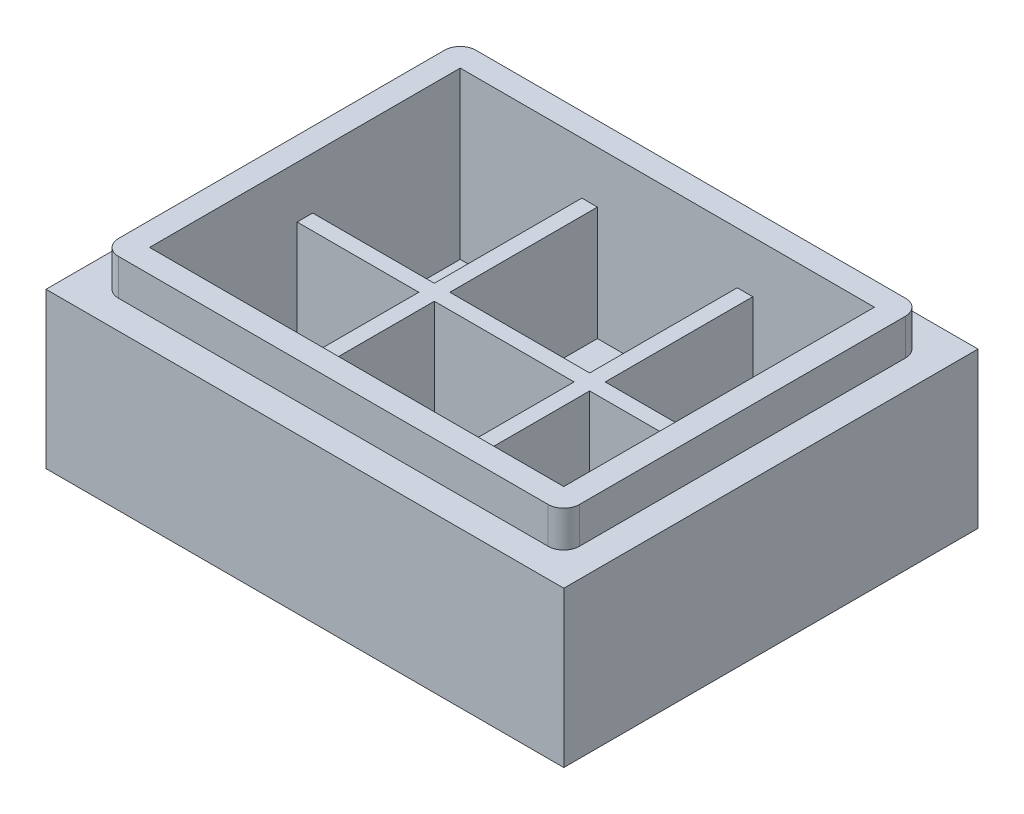
ISO-10303-21;
HEADER;
FILE_DESCRIPTION(('STEP AP214'),'2;1');
FILE_NAME('part.step','',(''),(''),'','','');
FILE_SCHEMA(('AUTOMOTIVE_DESIGN { 1 0 10303 214 1 1 1 1 }'));
ENDSEC;
DATA;
#1=APPLICATION_CONTEXT('core data for automotive mechanical design processes');
#2=APPLICATION_PROTOCOL_DEFINITION('international standard','automotive_design',2000,#1);
#3=PRODUCT_CONTEXT('',#1,'mechanical');
#4=PRODUCT('Part','Part','',(#3));
#5=PRODUCT_RELATED_PRODUCT_CATEGORY('part','',(#4));
#6=PRODUCT_DEFINITION_FORMATION('','',#4);
#7=PRODUCT_DEFINITION_CONTEXT('part definition',#1,'design');
#8=PRODUCT_DEFINITION('design','',#6,#7);
#9=PRODUCT_DEFINITION_SHAPE('','',#8);
#10=(LENGTH_UNIT() NAMED_UNIT(*) SI_UNIT(.MILLI.,.METRE.));
#11=(NAMED_UNIT(*) PLANE_ANGLE_UNIT() SI_UNIT($,.RADIAN.));
#12=(NAMED_UNIT(*) SI_UNIT($,.STERADIAN.) SOLID_ANGLE_UNIT());
#13=UNCERTAINTY_MEASURE_WITH_UNIT(LENGTH_MEASURE(1.E-05),#10,'distance_accuracy_value','');
#14=(GEOMETRIC_REPRESENTATION_CONTEXT(3) GLOBAL_UNCERTAINTY_ASSIGNED_CONTEXT((#13)) GLOBAL_UNIT_ASSIGNED_CONTEXT((#10,
#11,#12)) REPRESENTATION_CONTEXT('',''));
#15=CARTESIAN_POINT('',(0.,0.,0.));
#16=DIRECTION('',(0.,0.,1.));
#17=DIRECTION('',(1.,0.,0.));
#18=AXIS2_PLACEMENT_3D('',#15,#16,#17);
#19=CARTESIAN_POINT('',(0.,30.,0.));
#20=DIRECTION('',(0.,1.,0.));
#21=DIRECTION('',(0.,0.,1.));
#22=AXIS2_PLACEMENT_3D('',#19,#20,#21);
#23=PLANE('',#22);
#24=DIRECTION('',(0.,0.,-1.));
#25=VECTOR('',#24,1.);
#26=CARTESIAN_POINT('',(50.,30.,-40.));
#27=LINE('',#26,#25);
#28=CARTESIAN_POINT('',(50.,30.,40.));
#29=VERTEX_POINT('',#28);
#30=CARTESIAN_POINT('',(50.,30.,-40.));
#31=VERTEX_POINT('',#30);
#32=EDGE_CURVE('E497',#29,#31,#27,.T.);
#33=ORIENTED_EDGE('',*,*,#32,.T.);
#34=DIRECTION('',(-1.,0.,0.));
#35=VECTOR('',#34,1.);
#36=CARTESIAN_POINT('',(-50.,30.,-40.));
#37=LINE('',#36,#35);
#38=CARTESIAN_POINT('',(-50.,30.,-40.));
#39=VERTEX_POINT('',#38);
#40=EDGE_CURVE('E500',#31,#39,#37,.T.);
#41=ORIENTED_EDGE('',*,*,#40,.T.);
#42=DIRECTION('',(0.,0.,1.));
#43=VECTOR('',#42,1.);
#44=CARTESIAN_POINT('',(-50.,30.,-40.));
#45=LINE('',#44,#43);
#46=CARTESIAN_POINT('',(-50.,30.,40.));
#47=VERTEX_POINT('',#46);
#48=EDGE_CURVE('E503',#39,#47,#45,.T.);
#49=ORIENTED_EDGE('',*,*,#48,.T.);
#50=DIRECTION('',(1.,0.,0.));
#51=VECTOR('',#50,1.);
#52=CARTESIAN_POINT('',(-50.,30.,40.));
#53=LINE('',#52,#51);
#54=EDGE_CURVE('E505',#47,#29,#53,.T.);
#55=ORIENTED_EDGE('',*,*,#54,.T.);
#56=EDGE_LOOP('',(#33,#41,#49,#55));
#57=FACE_BOUND('',#56,.T.);
#58=DIRECTION('',(1.,0.,0.));
#59=VECTOR('',#58,1.);
#60=CARTESIAN_POINT('',(-44.5,30.,34.5));
#61=LINE('',#60,#59);
#62=CARTESIAN_POINT('',(-41.5,30.,34.5));
#63=VERTEX_POINT('',#62);
#64=CARTESIAN_POINT('',(41.5,30.,34.5));
#65=VERTEX_POINT('',#64);
#66=EDGE_CURVE('E322',#63,#65,#61,.T.);
#67=ORIENTED_EDGE('',*,*,#66,.F.);
#68=CARTESIAN_POINT('',(-41.5,30.,31.5));
#69=DIRECTION('',(0.,1.,0.));
#70=DIRECTION('',(0.,0.,1.));
#71=AXIS2_PLACEMENT_3D('',#68,#69,#70);
#72=CIRCLE('',#71,3.);
#73=CARTESIAN_POINT('',(-44.5,30.,31.5));
#74=VERTEX_POINT('',#73);
#75=EDGE_CURVE('E50',#63,#74,#72,.F.);
#76=ORIENTED_EDGE('',*,*,#75,.T.);
#77=DIRECTION('',(0.,0.,1.));
#78=VECTOR('',#77,1.);
#79=CARTESIAN_POINT('',(-44.5,30.,-34.5));
#80=LINE('',#79,#78);
#81=CARTESIAN_POINT('',(-44.5,30.,-31.5));
#82=VERTEX_POINT('',#81);
#83=EDGE_CURVE('E305',#82,#74,#80,.T.);
#84=ORIENTED_EDGE('',*,*,#83,.F.);
#85=CARTESIAN_POINT('',(-41.5,30.,-31.5));
#86=DIRECTION('',(0.,1.,0.));
#87=DIRECTION('',(0.,0.,1.));
#88=AXIS2_PLACEMENT_3D('',#85,#86,#87);
#89=CIRCLE('',#88,3.);
#90=CARTESIAN_POINT('',(-41.5,30.,-34.5));
#91=VERTEX_POINT('',#90);
#92=EDGE_CURVE('E558',#82,#91,#89,.F.);
#93=ORIENTED_EDGE('',*,*,#92,.T.);
#94=DIRECTION('',(-1.,0.,0.));
#95=VECTOR('',#94,1.);
#96=CARTESIAN_POINT('',(44.5,30.,-34.5));
#97=LINE('',#96,#95);
#98=CARTESIAN_POINT('',(41.5,30.,-34.5));
#99=VERTEX_POINT('',#98);
#100=EDGE_CURVE('E310',#99,#91,#97,.T.);
#101=ORIENTED_EDGE('',*,*,#100,.F.);
#102=CARTESIAN_POINT('',(41.5,30.,-31.5));
#103=DIRECTION('',(0.,1.,0.));
#104=DIRECTION('',(0.,0.,1.));
#105=AXIS2_PLACEMENT_3D('',#102,#103,#104);
#106=CIRCLE('',#105,3.);
#107=CARTESIAN_POINT('',(44.5,30.,-31.5));
#108=VERTEX_POINT('',#107);
#109=EDGE_CURVE('E556',#99,#108,#106,.F.);
#110=ORIENTED_EDGE('',*,*,#109,.T.);
#111=DIRECTION('',(0.,0.,-1.));
#112=VECTOR('',#111,1.);
#113=CARTESIAN_POINT('',(44.5,30.,34.5));
#114=LINE('',#113,#112);
#115=CARTESIAN_POINT('',(44.5,30.,31.5));
#116=VERTEX_POINT('',#115);
#117=EDGE_CURVE('E324',#116,#108,#114,.T.);
#118=ORIENTED_EDGE('',*,*,#117,.F.);
#119=CARTESIAN_POINT('',(41.5,30.,31.5));
#120=DIRECTION('',(0.,1.,0.));
#121=DIRECTION('',(0.,0.,1.));
#122=AXIS2_PLACEMENT_3D('',#119,#120,#121);
#123=CIRCLE('',#122,3.);
#124=EDGE_CURVE('E11',#116,#65,#123,.F.);
#125=ORIENTED_EDGE('',*,*,#124,.T.);
#126=EDGE_LOOP('',(#67,#76,#84,#93,#101,#110,#118,#125));
#127=FACE_BOUND('',#126,.T.);
#128=ADVANCED_FACE('F42',(#57,#127),#23,.T.);
#129=CARTESIAN_POINT('',(50.,30.,-40.));
#130=DIRECTION('',(-1.,0.,0.));
#131=DIRECTION('',(0.,0.,1.));
#132=AXIS2_PLACEMENT_3D('',#129,#130,#131);
#133=PLANE('',#132);
#134=DIRECTION('',(0.,0.,-1.));
#135=VECTOR('',#134,1.);
#136=CARTESIAN_POINT('',(50.,0.,-40.));
#137=LINE('',#136,#135);
#138=CARTESIAN_POINT('',(50.,0.,40.));
#139=VERTEX_POINT('',#138);
#140=CARTESIAN_POINT('',(50.,0.,-40.));
#141=VERTEX_POINT('',#140);
#142=EDGE_CURVE('E492',#139,#141,#137,.T.);
#143=ORIENTED_EDGE('',*,*,#142,.T.);
#144=DIRECTION('',(0.,-1.,0.));
#145=VECTOR('',#144,1.);
#146=CARTESIAN_POINT('',(50.,30.,-40.));
#147=LINE('',#146,#145);
#148=EDGE_CURVE('E523',#31,#141,#147,.T.);
#149=ORIENTED_EDGE('',*,*,#148,.F.);
#150=ORIENTED_EDGE('',*,*,#32,.F.);
#151=DIRECTION('',(0.,-1.,0.));
#152=VECTOR('',#151,1.);
#153=CARTESIAN_POINT('',(50.,30.,40.));
#154=LINE('',#153,#152);
#155=EDGE_CURVE('E507',#29,#139,#154,.T.);
#156=ORIENTED_EDGE('',*,*,#155,.T.);
#157=EDGE_LOOP('',(#143,#149,#150,#156));
#158=FACE_BOUND('',#157,.T.);
#159=ADVANCED_FACE('F598',(#158),#133,.F.);
#160=CARTESIAN_POINT('',(-50.,30.,-40.));
#161=DIRECTION('',(0.,0.,1.));
#162=DIRECTION('',(1.,0.,0.));
#163=AXIS2_PLACEMENT_3D('',#160,#161,#162);
#164=PLANE('',#163);
#165=DIRECTION('',(-1.,0.,0.));
#166=VECTOR('',#165,1.);
#167=CARTESIAN_POINT('',(-50.,0.,-40.));
#168=LINE('',#167,#166);
#169=CARTESIAN_POINT('',(-50.,0.,-40.));
#170=VERTEX_POINT('',#169);
#171=EDGE_CURVE('E510',#141,#170,#168,.T.);
#172=ORIENTED_EDGE('',*,*,#171,.T.);
#173=DIRECTION('',(0.,-1.,0.));
#174=VECTOR('',#173,1.);
#175=CARTESIAN_POINT('',(-50.,30.,-40.));
#176=LINE('',#175,#174);
#177=EDGE_CURVE('E520',#39,#170,#176,.T.);
#178=ORIENTED_EDGE('',*,*,#177,.F.);
#179=ORIENTED_EDGE('',*,*,#40,.F.);
#180=ORIENTED_EDGE('',*,*,#148,.T.);
#181=EDGE_LOOP('',(#172,#178,#179,#180));
#182=FACE_BOUND('',#181,.T.);
#183=ADVANCED_FACE('F606',(#182),#164,.F.);
#184=CARTESIAN_POINT('',(-50.,30.,-40.));
#185=DIRECTION('',(1.,0.,0.));
#186=DIRECTION('',(0.,0.,-1.));
#187=AXIS2_PLACEMENT_3D('',#184,#185,#186);
#188=PLANE('',#187);
#189=DIRECTION('',(0.,0.,1.));
#190=VECTOR('',#189,1.);
#191=CARTESIAN_POINT('',(-50.,0.,-40.));
#192=LINE('',#191,#190);
#193=CARTESIAN_POINT('',(-50.,0.,40.));
#194=VERTEX_POINT('',#193);
#195=EDGE_CURVE('E512',#170,#194,#192,.T.);
#196=ORIENTED_EDGE('',*,*,#195,.T.);
#197=DIRECTION('',(0.,-1.,0.));
#198=VECTOR('',#197,1.);
#199=CARTESIAN_POINT('',(-50.,30.,40.));
#200=LINE('',#199,#198);
#201=EDGE_CURVE('E517',#47,#194,#200,.T.);
#202=ORIENTED_EDGE('',*,*,#201,.F.);
#203=ORIENTED_EDGE('',*,*,#48,.F.);
#204=ORIENTED_EDGE('',*,*,#177,.T.);
#205=EDGE_LOOP('',(#196,#202,#203,#204));
#206=FACE_BOUND('',#205,.T.);
#207=ADVANCED_FACE('F620',(#206),#188,.F.);
#208=CARTESIAN_POINT('',(-50.,30.,40.));
#209=DIRECTION('',(0.,0.,-1.));
#210=DIRECTION('',(-1.,0.,0.));
#211=AXIS2_PLACEMENT_3D('',#208,#209,#210);
#212=PLANE('',#211);
#213=DIRECTION('',(1.,0.,0.));
#214=VECTOR('',#213,1.);
#215=CARTESIAN_POINT('',(-50.,0.,40.));
#216=LINE('',#215,#214);
#217=EDGE_CURVE('E501',#194,#139,#216,.T.);
#218=ORIENTED_EDGE('',*,*,#217,.T.);
#219=ORIENTED_EDGE('',*,*,#155,.F.);
#220=ORIENTED_EDGE('',*,*,#54,.F.);
#221=ORIENTED_EDGE('',*,*,#201,.T.);
#222=EDGE_LOOP('',(#218,#219,#220,#221));
#223=FACE_BOUND('',#222,.T.);
#224=ADVANCED_FACE('F616',(#223),#212,.F.);
#225=CARTESIAN_POINT('',(0.,0.,0.));
#226=DIRECTION('',(0.,1.,0.));
#227=DIRECTION('',(0.,0.,1.));
#228=AXIS2_PLACEMENT_3D('',#225,#226,#227);
#229=PLANE('',#228);
#230=ORIENTED_EDGE('',*,*,#142,.F.);
#231=ORIENTED_EDGE('',*,*,#217,.F.);
#232=ORIENTED_EDGE('',*,*,#195,.F.);
#233=ORIENTED_EDGE('',*,*,#171,.F.);
#234=EDGE_LOOP('',(#230,#231,#232,#233));
#235=FACE_BOUND('',#234,.T.);
#236=ADVANCED_FACE('F613',(#235),#229,.F.);
#237=CARTESIAN_POINT('',(0.,37.,0.));
#238=DIRECTION('',(0.,1.,0.));
#239=DIRECTION('',(0.,0.,1.));
#240=AXIS2_PLACEMENT_3D('',#237,#238,#239);
#241=PLANE('',#240);
#242=DIRECTION('',(0.,0.,-1.));
#243=VECTOR('',#242,1.);
#244=CARTESIAN_POINT('',(44.5,37.,34.5));
#245=LINE('',#244,#243);
#246=CARTESIAN_POINT('',(44.5,37.,31.5));
#247=VERTEX_POINT('',#246);
#248=CARTESIAN_POINT('',(44.5,37.,-31.5));
#249=VERTEX_POINT('',#248);
#250=EDGE_CURVE('E313',#247,#249,#245,.T.);
#251=ORIENTED_EDGE('',*,*,#250,.T.);
#252=CARTESIAN_POINT('',(41.5,37.,-31.5));
#253=DIRECTION('',(0.,1.,0.));
#254=DIRECTION('',(0.,0.,1.));
#255=AXIS2_PLACEMENT_3D('',#252,#253,#254);
#256=CIRCLE('',#255,3.);
#257=CARTESIAN_POINT('',(41.5,37.,-34.5));
#258=VERTEX_POINT('',#257);
#259=EDGE_CURVE('E545',#249,#258,#256,.T.);
#260=ORIENTED_EDGE('',*,*,#259,.T.);
#261=DIRECTION('',(-1.,0.,0.));
#262=VECTOR('',#261,1.);
#263=CARTESIAN_POINT('',(44.5,37.,-34.5));
#264=LINE('',#263,#262);
#265=CARTESIAN_POINT('',(-41.5,37.,-34.5));
#266=VERTEX_POINT('',#265);
#267=EDGE_CURVE('E316',#258,#266,#264,.T.);
#268=ORIENTED_EDGE('',*,*,#267,.T.);
#269=CARTESIAN_POINT('',(-41.5,37.,-31.5));
#270=DIRECTION('',(0.,1.,0.));
#271=DIRECTION('',(0.,0.,1.));
#272=AXIS2_PLACEMENT_3D('',#269,#270,#271);
#273=CIRCLE('',#272,3.);
#274=CARTESIAN_POINT('',(-44.5,37.,-31.5));
#275=VERTEX_POINT('',#274);
#276=EDGE_CURVE('E543',#266,#275,#273,.T.);
#277=ORIENTED_EDGE('',*,*,#276,.T.);
#278=DIRECTION('',(0.,0.,1.));
#279=VECTOR('',#278,1.);
#280=CARTESIAN_POINT('',(-44.5,37.,-34.5));
#281=LINE('',#280,#279);
#282=CARTESIAN_POINT('',(-44.5,37.,31.5));
#283=VERTEX_POINT('',#282);
#284=EDGE_CURVE('E306',#275,#283,#281,.T.);
#285=ORIENTED_EDGE('',*,*,#284,.T.);
#286=CARTESIAN_POINT('',(-41.5,37.,31.5));
#287=DIRECTION('',(0.,1.,0.));
#288=DIRECTION('',(0.,0.,1.));
#289=AXIS2_PLACEMENT_3D('',#286,#287,#288);
#290=CIRCLE('',#289,3.);
#291=CARTESIAN_POINT('',(-41.5,37.,34.5));
#292=VERTEX_POINT('',#291);
#293=EDGE_CURVE('E541',#283,#292,#290,.T.);
#294=ORIENTED_EDGE('',*,*,#293,.T.);
#295=DIRECTION('',(1.,0.,0.));
#296=VECTOR('',#295,1.);
#297=CARTESIAN_POINT('',(-44.5,37.,34.5));
#298=LINE('',#297,#296);
#299=CARTESIAN_POINT('',(41.5,37.,34.5));
#300=VERTEX_POINT('',#299);
#301=EDGE_CURVE('E309',#292,#300,#298,.T.);
#302=ORIENTED_EDGE('',*,*,#301,.T.);
#303=CARTESIAN_POINT('',(41.5,37.,31.5));
#304=DIRECTION('',(0.,1.,0.));
#305=DIRECTION('',(0.,0.,1.));
#306=AXIS2_PLACEMENT_3D('',#303,#304,#305);
#307=CIRCLE('',#306,3.);
#308=EDGE_CURVE('E539',#300,#247,#307,.T.);
#309=ORIENTED_EDGE('',*,*,#308,.T.);
#310=EDGE_LOOP('',(#251,#260,#268,#277,#285,#294,#302,#309));
#311=FACE_BOUND('',#310,.T.);
#312=DIRECTION('',(0.,0.,1.));
#313=VECTOR('',#312,1.);
#314=CARTESIAN_POINT('',(-40.,37.,-30.));
#315=LINE('',#314,#313);
#316=CARTESIAN_POINT('',(-40.,37.,-30.));
#317=VERTEX_POINT('',#316);
#318=CARTESIAN_POINT('',(-40.,37.,30.));
#319=VERTEX_POINT('',#318);
#320=EDGE_CURVE('E278',#317,#319,#315,.T.);
#321=ORIENTED_EDGE('',*,*,#320,.F.);
#322=DIRECTION('',(-1.,0.,0.));
#323=VECTOR('',#322,1.);
#324=CARTESIAN_POINT('',(40.,37.,-30.));
#325=LINE('',#324,#323);
#326=CARTESIAN_POINT('',(40.,37.,-30.));
#327=VERTEX_POINT('',#326);
#328=EDGE_CURVE('E289',#327,#317,#325,.T.);
#329=ORIENTED_EDGE('',*,*,#328,.F.);
#330=DIRECTION('',(0.,0.,-1.));
#331=VECTOR('',#330,1.);
#332=CARTESIAN_POINT('',(40.,37.,30.));
#333=LINE('',#332,#331);
#334=CARTESIAN_POINT('',(40.,37.,30.));
#335=VERTEX_POINT('',#334);
#336=EDGE_CURVE('E301',#335,#327,#333,.T.);
#337=ORIENTED_EDGE('',*,*,#336,.F.);
#338=DIRECTION('',(1.,0.,0.));
#339=VECTOR('',#338,1.);
#340=CARTESIAN_POINT('',(-40.,37.,30.));
#341=LINE('',#340,#339);
#342=EDGE_CURVE('E299',#319,#335,#341,.T.);
#343=ORIENTED_EDGE('',*,*,#342,.F.);
#344=EDGE_LOOP('',(#321,#329,#337,#343));
#345=FACE_BOUND('',#344,.T.);
#346=ADVANCED_FACE('F297',(#311,#345),#241,.T.);
#347=CARTESIAN_POINT('',(-44.5,37.,-34.5));
#348=DIRECTION('',(1.,0.,0.));
#349=DIRECTION('',(0.,0.,-1.));
#350=AXIS2_PLACEMENT_3D('',#347,#348,#349);
#351=PLANE('',#350);
#352=ORIENTED_EDGE('',*,*,#284,.F.);
#353=DIRECTION('',(0.,-1.,0.));
#354=VECTOR('',#353,1.);
#355=CARTESIAN_POINT('',(-44.5,37.,-31.5));
#356=LINE('',#355,#354);
#357=EDGE_CURVE('E549',#275,#82,#356,.T.);
#358=ORIENTED_EDGE('',*,*,#357,.T.);
#359=ORIENTED_EDGE('',*,*,#83,.T.);
#360=DIRECTION('',(0.,-1.,0.));
#361=VECTOR('',#360,1.);
#362=CARTESIAN_POINT('',(-44.5,37.,31.5));
#363=LINE('',#362,#361);
#364=EDGE_CURVE('E547',#74,#283,#363,.F.);
#365=ORIENTED_EDGE('',*,*,#364,.T.);
#366=EDGE_LOOP('',(#352,#358,#359,#365));
#367=FACE_BOUND('',#366,.T.);
#368=ADVANCED_FACE('F562',(#367),#351,.F.);
#369=CARTESIAN_POINT('',(-44.5,37.,34.5));
#370=DIRECTION('',(0.,0.,-1.));
#371=DIRECTION('',(-1.,0.,0.));
#372=AXIS2_PLACEMENT_3D('',#369,#370,#371);
#373=PLANE('',#372);
#374=ORIENTED_EDGE('',*,*,#301,.F.);
#375=DIRECTION('',(0.,-1.,0.));
#376=VECTOR('',#375,1.);
#377=CARTESIAN_POINT('',(-41.5,37.,34.5));
#378=LINE('',#377,#376);
#379=EDGE_CURVE('E554',#292,#63,#378,.T.);
#380=ORIENTED_EDGE('',*,*,#379,.T.);
#381=ORIENTED_EDGE('',*,*,#66,.T.);
#382=DIRECTION('',(0.,-1.,0.));
#383=VECTOR('',#382,1.);
#384=CARTESIAN_POINT('',(41.5,37.,34.5));
#385=LINE('',#384,#383);
#386=EDGE_CURVE('E552',#65,#300,#385,.F.);
#387=ORIENTED_EDGE('',*,*,#386,.T.);
#388=EDGE_LOOP('',(#374,#380,#381,#387));
#389=FACE_BOUND('',#388,.T.);
#390=ADVANCED_FACE('F570',(#389),#373,.F.);
#391=CARTESIAN_POINT('',(44.5,37.,34.5));
#392=DIRECTION('',(-1.,0.,0.));
#393=DIRECTION('',(0.,0.,1.));
#394=AXIS2_PLACEMENT_3D('',#391,#392,#393);
#395=PLANE('',#394);
#396=ORIENTED_EDGE('',*,*,#117,.T.);
#397=DIRECTION('',(0.,-1.,0.));
#398=VECTOR('',#397,1.);
#399=CARTESIAN_POINT('',(44.5,37.,-31.5));
#400=LINE('',#399,#398);
#401=EDGE_CURVE('E537',#108,#249,#400,.F.);
#402=ORIENTED_EDGE('',*,*,#401,.T.);
#403=ORIENTED_EDGE('',*,*,#250,.F.);
#404=DIRECTION('',(0.,-1.,0.));
#405=VECTOR('',#404,1.);
#406=CARTESIAN_POINT('',(44.5,37.,31.5));
#407=LINE('',#406,#405);
#408=EDGE_CURVE('E534',#247,#116,#407,.T.);
#409=ORIENTED_EDGE('',*,*,#408,.T.);
#410=EDGE_LOOP('',(#396,#402,#403,#409));
#411=FACE_BOUND('',#410,.T.);
#412=ADVANCED_FACE('F577',(#411),#395,.F.);
#413=CARTESIAN_POINT('',(44.5,37.,-34.5));
#414=DIRECTION('',(0.,0.,1.));
#415=DIRECTION('',(1.,0.,0.));
#416=AXIS2_PLACEMENT_3D('',#413,#414,#415);
#417=PLANE('',#416);
#418=ORIENTED_EDGE('',*,*,#267,.F.);
#419=DIRECTION('',(0.,-1.,0.));
#420=VECTOR('',#419,1.);
#421=CARTESIAN_POINT('',(41.5,37.,-34.5));
#422=LINE('',#421,#420);
#423=EDGE_CURVE('E531',#258,#99,#422,.T.);
#424=ORIENTED_EDGE('',*,*,#423,.T.);
#425=ORIENTED_EDGE('',*,*,#100,.T.);
#426=DIRECTION('',(0.,-1.,0.));
#427=VECTOR('',#426,1.);
#428=CARTESIAN_POINT('',(-41.5,37.,-34.5));
#429=LINE('',#428,#427);
#430=EDGE_CURVE('E529',#91,#266,#429,.F.);
#431=ORIENTED_EDGE('',*,*,#430,.T.);
#432=EDGE_LOOP('',(#418,#424,#425,#431));
#433=FACE_BOUND('',#432,.T.);
#434=ADVANCED_FACE('F585',(#433),#417,.F.);
#435=CARTESIAN_POINT('',(0.,5.,-1.5));
#436=DIRECTION('',(0.,0.,1.));
#437=DIRECTION('',(1.,0.,0.));
#438=AXIS2_PLACEMENT_3D('',#435,#436,#437);
#439=PLANE('',#438);
#440=DIRECTION('',(-1.,0.,0.));
#441=VECTOR('',#440,1.);
#442=CARTESIAN_POINT('',(0.,27.,-1.5));
#443=LINE('',#442,#441);
#444=CARTESIAN_POINT('',(13.5,27.,-1.5));
#445=VERTEX_POINT('',#444);
#446=CARTESIAN_POINT('',(-13.5,27.,-1.5));
#447=VERTEX_POINT('',#446);
#448=EDGE_CURVE('E360',#445,#447,#443,.T.);
#449=ORIENTED_EDGE('',*,*,#448,.F.);
#450=DIRECTION('',(0.,1.,0.));
#451=VECTOR('',#450,1.);
#452=CARTESIAN_POINT('',(13.5,5.,-1.5));
#453=LINE('',#452,#451);
#454=CARTESIAN_POINT('',(13.5,5.,-1.5));
#455=VERTEX_POINT('',#454);
#456=EDGE_CURVE('E387',#455,#445,#453,.T.);
#457=ORIENTED_EDGE('',*,*,#456,.F.);
#458=DIRECTION('',(1.,0.,0.));
#459=VECTOR('',#458,1.);
#460=CARTESIAN_POINT('',(0.,5.,-1.5));
#461=LINE('',#460,#459);
#462=CARTESIAN_POINT('',(-13.5,5.,-1.5));
#463=VERTEX_POINT('',#462);
#464=EDGE_CURVE('E377',#463,#455,#461,.T.);
#465=ORIENTED_EDGE('',*,*,#464,.F.);
#466=DIRECTION('',(0.,1.,0.));
#467=VECTOR('',#466,1.);
#468=CARTESIAN_POINT('',(-13.5,5.,-1.5));
#469=LINE('',#468,#467);
#470=EDGE_CURVE('E390',#463,#447,#469,.T.);
#471=ORIENTED_EDGE('',*,*,#470,.T.);
#472=EDGE_LOOP('',(#449,#457,#465,#471));
#473=FACE_BOUND('',#472,.T.);
#474=ADVANCED_FACE('F752',(#473),#439,.F.);
#475=CARTESIAN_POINT('',(0.,5.,1.5));
#476=DIRECTION('',(0.,0.,1.));
#477=DIRECTION('',(1.,0.,0.));
#478=AXIS2_PLACEMENT_3D('',#475,#476,#477);
#479=PLANE('',#478);
#480=DIRECTION('',(0.,1.,0.));
#481=VECTOR('',#480,1.);
#482=CARTESIAN_POINT('',(13.5,5.,1.5));
#483=LINE('',#482,#481);
#484=CARTESIAN_POINT('',(13.5,5.,1.5));
#485=VERTEX_POINT('',#484);
#486=CARTESIAN_POINT('',(13.5,27.,1.5));
#487=VERTEX_POINT('',#486);
#488=EDGE_CURVE('E421',#485,#487,#483,.T.);
#489=ORIENTED_EDGE('',*,*,#488,.T.);
#490=DIRECTION('',(-1.,0.,0.));
#491=VECTOR('',#490,1.);
#492=CARTESIAN_POINT('',(0.,27.,1.5));
#493=LINE('',#492,#491);
#494=CARTESIAN_POINT('',(-13.5,27.,1.5));
#495=VERTEX_POINT('',#494);
#496=EDGE_CURVE('E343',#487,#495,#493,.T.);
#497=ORIENTED_EDGE('',*,*,#496,.T.);
#498=DIRECTION('',(0.,1.,0.));
#499=VECTOR('',#498,1.);
#500=CARTESIAN_POINT('',(-13.5,5.,1.5));
#501=LINE('',#500,#499);
#502=CARTESIAN_POINT('',(-13.5,5.,1.5));
#503=VERTEX_POINT('',#502);
#504=EDGE_CURVE('E452',#503,#495,#501,.T.);
#505=ORIENTED_EDGE('',*,*,#504,.F.);
#506=DIRECTION('',(1.,0.,0.));
#507=VECTOR('',#506,1.);
#508=CARTESIAN_POINT('',(0.,5.,1.5));
#509=LINE('',#508,#507);
#510=EDGE_CURVE('E440',#503,#485,#509,.T.);
#511=ORIENTED_EDGE('',*,*,#510,.T.);
#512=EDGE_LOOP('',(#489,#497,#505,#511));
#513=FACE_BOUND('',#512,.T.);
#514=ADVANCED_FACE('F755',(#513),#479,.T.);
#515=CARTESIAN_POINT('',(16.5,5.,0.));
#516=DIRECTION('',(-1.,0.,0.));
#517=DIRECTION('',(0.,0.,1.));
#518=AXIS2_PLACEMENT_3D('',#515,#516,#517);
#519=PLANE('',#518);
#520=DIRECTION('',(0.,0.,-1.));
#521=VECTOR('',#520,1.);
#522=CARTESIAN_POINT('',(16.5,27.,0.));
#523=LINE('',#522,#521);
#524=CARTESIAN_POINT('',(16.5,27.,-1.5));
#525=VERTEX_POINT('',#524);
#526=CARTESIAN_POINT('',(16.5,27.,-30.));
#527=VERTEX_POINT('',#526);
#528=EDGE_CURVE('E354',#525,#527,#523,.T.);
#529=ORIENTED_EDGE('',*,*,#528,.F.);
#530=DIRECTION('',(0.,1.,0.));
#531=VECTOR('',#530,1.);
#532=CARTESIAN_POINT('',(16.5,5.,-1.5));
#533=LINE('',#532,#531);
#534=CARTESIAN_POINT('',(16.5,5.,-1.5));
#535=VERTEX_POINT('',#534);
#536=EDGE_CURVE('E413',#535,#525,#533,.T.);
#537=ORIENTED_EDGE('',*,*,#536,.F.);
#538=DIRECTION('',(0.,0.,1.));
#539=VECTOR('',#538,1.);
#540=CARTESIAN_POINT('',(16.5,5.,0.));
#541=LINE('',#540,#539);
#542=CARTESIAN_POINT('',(16.5,5.,-30.));
#543=VERTEX_POINT('',#542);
#544=EDGE_CURVE('E398',#543,#535,#541,.T.);
#545=ORIENTED_EDGE('',*,*,#544,.F.);
#546=DIRECTION('',(0.,1.,0.));
#547=VECTOR('',#546,1.);
#548=CARTESIAN_POINT('',(16.5,5.,-30.));
#549=LINE('',#548,#547);
#550=EDGE_CURVE('E408',#543,#527,#549,.T.);
#551=ORIENTED_EDGE('',*,*,#550,.T.);
#552=EDGE_LOOP('',(#529,#537,#545,#551));
#553=FACE_BOUND('',#552,.T.);
#554=ADVANCED_FACE('F746',(#553),#519,.F.);
#555=CARTESIAN_POINT('',(13.5,5.,0.));
#556=DIRECTION('',(-1.,0.,0.));
#557=DIRECTION('',(0.,0.,1.));
#558=AXIS2_PLACEMENT_3D('',#555,#556,#557);
#559=PLANE('',#558);
#560=ORIENTED_EDGE('',*,*,#456,.T.);
#561=DIRECTION('',(0.,0.,-1.));
#562=VECTOR('',#561,1.);
#563=CARTESIAN_POINT('',(13.5,27.,0.));
#564=LINE('',#563,#562);
#565=CARTESIAN_POINT('',(13.5,27.,-30.));
#566=VERTEX_POINT('',#565);
#567=EDGE_CURVE('E362',#445,#566,#564,.T.);
#568=ORIENTED_EDGE('',*,*,#567,.T.);
#569=DIRECTION('',(0.,1.,0.));
#570=VECTOR('',#569,1.);
#571=CARTESIAN_POINT('',(13.5,5.,-30.));
#572=LINE('',#571,#570);
#573=CARTESIAN_POINT('',(13.5,5.,-30.));
#574=VERTEX_POINT('',#573);
#575=EDGE_CURVE('E383',#574,#566,#572,.T.);
#576=ORIENTED_EDGE('',*,*,#575,.F.);
#577=DIRECTION('',(0.,0.,1.));
#578=VECTOR('',#577,1.);
#579=CARTESIAN_POINT('',(13.5,5.,0.));
#580=LINE('',#579,#578);
#581=EDGE_CURVE('E380',#574,#455,#580,.T.);
#582=ORIENTED_EDGE('',*,*,#581,.T.);
#583=EDGE_LOOP('',(#560,#568,#576,#582));
#584=FACE_BOUND('',#583,.T.);
#585=ADVANCED_FACE('F676',(#584),#559,.T.);
#586=CARTESIAN_POINT('',(0.,5.,0.));
#587=DIRECTION('',(0.,1.,0.));
#588=DIRECTION('',(0.,0.,1.));
#589=AXIS2_PLACEMENT_3D('',#586,#587,#588);
#590=PLANE('',#589);
#591=DIRECTION('',(-1.,0.,0.));
#592=VECTOR('',#591,1.);
#593=CARTESIAN_POINT('',(0.,5.,-30.));
#594=LINE('',#593,#592);
#595=CARTESIAN_POINT('',(-13.5,5.,-30.));
#596=VERTEX_POINT('',#595);
#597=EDGE_CURVE('E371',#574,#596,#594,.T.);
#598=ORIENTED_EDGE('',*,*,#597,.T.);
#599=DIRECTION('',(0.,0.,1.));
#600=VECTOR('',#599,1.);
#601=CARTESIAN_POINT('',(-13.5,5.,0.));
#602=LINE('',#601,#600);
#603=EDGE_CURVE('E374',#596,#463,#602,.T.);
#604=ORIENTED_EDGE('',*,*,#603,.T.);
#605=ORIENTED_EDGE('',*,*,#464,.T.);
#606=ORIENTED_EDGE('',*,*,#581,.F.);
#607=EDGE_LOOP('',(#598,#604,#605,#606));
#608=FACE_BOUND('',#607,.T.);
#609=ADVANCED_FACE('F672',(#608),#590,.T.);
#610=CARTESIAN_POINT('',(-13.5,5.,0.));
#611=DIRECTION('',(-1.,0.,0.));
#612=DIRECTION('',(0.,0.,1.));
#613=AXIS2_PLACEMENT_3D('',#610,#611,#612);
#614=PLANE('',#613);
#615=DIRECTION('',(0.,0.,-1.));
#616=VECTOR('',#615,1.);
#617=CARTESIAN_POINT('',(-13.5,27.,0.));
#618=LINE('',#617,#616);
#619=CARTESIAN_POINT('',(-13.5,27.,-30.));
#620=VERTEX_POINT('',#619);
#621=EDGE_CURVE('E358',#447,#620,#618,.T.);
#622=ORIENTED_EDGE('',*,*,#621,.F.);
#623=ORIENTED_EDGE('',*,*,#470,.F.);
#624=ORIENTED_EDGE('',*,*,#603,.F.);
#625=DIRECTION('',(0.,1.,0.));
#626=VECTOR('',#625,1.);
#627=CARTESIAN_POINT('',(-13.5,5.,-30.));
#628=LINE('',#627,#626);
#629=EDGE_CURVE('E382',#596,#620,#628,.T.);
#630=ORIENTED_EDGE('',*,*,#629,.T.);
#631=EDGE_LOOP('',(#622,#623,#624,#630));
#632=FACE_BOUND('',#631,.T.);
#633=ADVANCED_FACE('F675',(#632),#614,.F.);
#634=CARTESIAN_POINT('',(-16.5,5.,0.));
#635=DIRECTION('',(-1.,0.,0.));
#636=DIRECTION('',(0.,0.,1.));
#637=AXIS2_PLACEMENT_3D('',#634,#635,#636);
#638=PLANE('',#637);
#639=DIRECTION('',(0.,1.,0.));
#640=VECTOR('',#639,1.);
#641=CARTESIAN_POINT('',(-16.5,5.,-1.5));
#642=LINE('',#641,#640);
#643=CARTESIAN_POINT('',(-16.5,5.,-1.5));
#644=VERTEX_POINT('',#643);
#645=CARTESIAN_POINT('',(-16.5,27.,-1.5));
#646=VERTEX_POINT('',#645);
#647=EDGE_CURVE('E489',#644,#646,#642,.T.);
#648=ORIENTED_EDGE('',*,*,#647,.T.);
#649=DIRECTION('',(0.,0.,-1.));
#650=VECTOR('',#649,1.);
#651=CARTESIAN_POINT('',(-16.5,27.,0.));
#652=LINE('',#651,#650);
#653=CARTESIAN_POINT('',(-16.5,27.,-30.));
#654=VERTEX_POINT('',#653);
#655=EDGE_CURVE('E367',#646,#654,#652,.T.);
#656=ORIENTED_EDGE('',*,*,#655,.T.);
#657=DIRECTION('',(0.,1.,0.));
#658=VECTOR('',#657,1.);
#659=CARTESIAN_POINT('',(-16.5,5.,-30.));
#660=LINE('',#659,#658);
#661=CARTESIAN_POINT('',(-16.5,5.,-30.));
#662=VERTEX_POINT('',#661);
#663=EDGE_CURVE('E286',#662,#654,#660,.T.);
#664=ORIENTED_EDGE('',*,*,#663,.F.);
#665=DIRECTION('',(0.,0.,1.));
#666=VECTOR('',#665,1.);
#667=CARTESIAN_POINT('',(-16.5,5.,0.));
#668=LINE('',#667,#666);
#669=EDGE_CURVE('E386',#662,#644,#668,.T.);
#670=ORIENTED_EDGE('',*,*,#669,.T.);
#671=EDGE_LOOP('',(#648,#656,#664,#670));
#672=FACE_BOUND('',#671,.T.);
#673=ADVANCED_FACE('F611',(#672),#638,.T.);
#674=CARTESIAN_POINT('',(0.,5.,1.5));
#675=DIRECTION('',(0.,0.,1.));
#676=DIRECTION('',(1.,0.,0.));
#677=AXIS2_PLACEMENT_3D('',#674,#675,#676);
#678=PLANE('',#677);
#679=DIRECTION('',(0.,1.,0.));
#680=VECTOR('',#679,1.);
#681=CARTESIAN_POINT('',(40.,5.,1.5));
#682=LINE('',#681,#680);
#683=CARTESIAN_POINT('',(40.,5.,1.5));
#684=VERTEX_POINT('',#683);
#685=CARTESIAN_POINT('',(40.,27.,1.5));
#686=VERTEX_POINT('',#685);
#687=EDGE_CURVE('E399',#684,#686,#682,.T.);
#688=ORIENTED_EDGE('',*,*,#687,.T.);
#689=DIRECTION('',(-1.,0.,0.));
#690=VECTOR('',#689,1.);
#691=CARTESIAN_POINT('',(0.,27.,1.5));
#692=LINE('',#691,#690);
#693=CARTESIAN_POINT('',(16.5,27.,1.5));
#694=VERTEX_POINT('',#693);
#695=EDGE_CURVE('E351',#686,#694,#692,.T.);
#696=ORIENTED_EDGE('',*,*,#695,.T.);
#697=DIRECTION('',(0.,1.,0.));
#698=VECTOR('',#697,1.);
#699=CARTESIAN_POINT('',(16.5,5.,1.5));
#700=LINE('',#699,#698);
#701=CARTESIAN_POINT('',(16.5,5.,1.5));
#702=VERTEX_POINT('',#701);
#703=EDGE_CURVE('E430',#702,#694,#700,.T.);
#704=ORIENTED_EDGE('',*,*,#703,.F.);
#705=DIRECTION('',(1.,0.,0.));
#706=VECTOR('',#705,1.);
#707=CARTESIAN_POINT('',(0.,5.,1.5));
#708=LINE('',#707,#706);
#709=EDGE_CURVE('E418',#702,#684,#708,.T.);
#710=ORIENTED_EDGE('',*,*,#709,.T.);
#711=EDGE_LOOP('',(#688,#696,#704,#710));
#712=FACE_BOUND('',#711,.T.);
#713=ADVANCED_FACE('F731',(#712),#678,.T.);
#714=CARTESIAN_POINT('',(0.,5.,-1.5));
#715=DIRECTION('',(0.,0.,1.));
#716=DIRECTION('',(1.,0.,0.));
#717=AXIS2_PLACEMENT_3D('',#714,#715,#716);
#718=PLANE('',#717);
#719=DIRECTION('',(-1.,0.,0.));
#720=VECTOR('',#719,1.);
#721=CARTESIAN_POINT('',(0.,27.,-1.5));
#722=LINE('',#721,#720);
#723=CARTESIAN_POINT('',(40.,27.,-1.5));
#724=VERTEX_POINT('',#723);
#725=EDGE_CURVE('E356',#724,#525,#722,.T.);
#726=ORIENTED_EDGE('',*,*,#725,.F.);
#727=DIRECTION('',(0.,1.,0.));
#728=VECTOR('',#727,1.);
#729=CARTESIAN_POINT('',(40.,5.,-1.5));
#730=LINE('',#729,#728);
#731=CARTESIAN_POINT('',(40.,5.,-1.5));
#732=VERTEX_POINT('',#731);
#733=EDGE_CURVE('E410',#732,#724,#730,.T.);
#734=ORIENTED_EDGE('',*,*,#733,.F.);
#735=DIRECTION('',(1.,0.,0.));
#736=VECTOR('',#735,1.);
#737=CARTESIAN_POINT('',(0.,5.,-1.5));
#738=LINE('',#737,#736);
#739=EDGE_CURVE('E402',#535,#732,#738,.T.);
#740=ORIENTED_EDGE('',*,*,#739,.F.);
#741=ORIENTED_EDGE('',*,*,#536,.T.);
#742=EDGE_LOOP('',(#726,#734,#740,#741));
#743=FACE_BOUND('',#742,.T.);
#744=ADVANCED_FACE('F688',(#743),#718,.F.);
#745=CARTESIAN_POINT('',(0.,5.,0.));
#746=DIRECTION('',(0.,1.,0.));
#747=DIRECTION('',(0.,0.,1.));
#748=AXIS2_PLACEMENT_3D('',#745,#746,#747);
#749=PLANE('',#748);
#750=DIRECTION('',(-1.,0.,0.));
#751=VECTOR('',#750,1.);
#752=CARTESIAN_POINT('',(0.,5.,-30.));
#753=LINE('',#752,#751);
#754=CARTESIAN_POINT('',(40.,5.,-30.));
#755=VERTEX_POINT('',#754);
#756=EDGE_CURVE('E395',#755,#543,#753,.T.);
#757=ORIENTED_EDGE('',*,*,#756,.T.);
#758=ORIENTED_EDGE('',*,*,#544,.T.);
#759=ORIENTED_EDGE('',*,*,#739,.T.);
#760=DIRECTION('',(0.,0.,-1.));
#761=VECTOR('',#760,1.);
#762=CARTESIAN_POINT('',(40.,5.,0.));
#763=LINE('',#762,#761);
#764=EDGE_CURVE('E405',#732,#755,#763,.T.);
#765=ORIENTED_EDGE('',*,*,#764,.T.);
#766=EDGE_LOOP('',(#757,#758,#759,#765));
#767=FACE_BOUND('',#766,.T.);
#768=ADVANCED_FACE('F683',(#767),#749,.T.);
#769=CARTESIAN_POINT('',(-16.5,5.,0.));
#770=DIRECTION('',(-1.,0.,0.));
#771=DIRECTION('',(0.,0.,1.));
#772=AXIS2_PLACEMENT_3D('',#769,#770,#771);
#773=PLANE('',#772);
#774=DIRECTION('',(0.,1.,0.));
#775=VECTOR('',#774,1.);
#776=CARTESIAN_POINT('',(-16.5,5.,30.));
#777=LINE('',#776,#775);
#778=CARTESIAN_POINT('',(-16.5,5.,30.));
#779=VERTEX_POINT('',#778);
#780=CARTESIAN_POINT('',(-16.5,27.,30.));
#781=VERTEX_POINT('',#780);
#782=EDGE_CURVE('E444',#779,#781,#777,.T.);
#783=ORIENTED_EDGE('',*,*,#782,.T.);
#784=DIRECTION('',(0.,0.,-1.));
#785=VECTOR('',#784,1.);
#786=CARTESIAN_POINT('',(-16.5,27.,0.));
#787=LINE('',#786,#785);
#788=CARTESIAN_POINT('',(-16.5,27.,1.5));
#789=VERTEX_POINT('',#788);
#790=EDGE_CURVE('E338',#781,#789,#787,.T.);
#791=ORIENTED_EDGE('',*,*,#790,.T.);
#792=DIRECTION('',(0.,1.,0.));
#793=VECTOR('',#792,1.);
#794=CARTESIAN_POINT('',(-16.5,5.,1.5));
#795=LINE('',#794,#793);
#796=CARTESIAN_POINT('',(-16.5,5.,1.5));
#797=VERTEX_POINT('',#796);
#798=EDGE_CURVE('E472',#797,#789,#795,.T.);
#799=ORIENTED_EDGE('',*,*,#798,.F.);
#800=DIRECTION('',(0.,0.,1.));
#801=VECTOR('',#800,1.);
#802=CARTESIAN_POINT('',(-16.5,5.,0.));
#803=LINE('',#802,#801);
#804=EDGE_CURVE('E370',#797,#779,#803,.T.);
#805=ORIENTED_EDGE('',*,*,#804,.T.);
#806=EDGE_LOOP('',(#783,#791,#799,#805));
#807=FACE_BOUND('',#806,.T.);
#808=ADVANCED_FACE('F687',(#807),#773,.T.);
#809=CARTESIAN_POINT('',(-13.5,5.,0.));
#810=DIRECTION('',(-1.,0.,0.));
#811=DIRECTION('',(0.,0.,1.));
#812=AXIS2_PLACEMENT_3D('',#809,#810,#811);
#813=PLANE('',#812);
#814=DIRECTION('',(0.,0.,-1.));
#815=VECTOR('',#814,1.);
#816=CARTESIAN_POINT('',(-13.5,27.,0.));
#817=LINE('',#816,#815);
#818=CARTESIAN_POINT('',(-13.5,27.,30.));
#819=VERTEX_POINT('',#818);
#820=EDGE_CURVE('E341',#819,#495,#817,.T.);
#821=ORIENTED_EDGE('',*,*,#820,.F.);
#822=DIRECTION('',(0.,1.,0.));
#823=VECTOR('',#822,1.);
#824=CARTESIAN_POINT('',(-13.5,5.,30.));
#825=LINE('',#824,#823);
#826=CARTESIAN_POINT('',(-13.5,5.,30.));
#827=VERTEX_POINT('',#826);
#828=EDGE_CURVE('E458',#827,#819,#825,.T.);
#829=ORIENTED_EDGE('',*,*,#828,.F.);
#830=DIRECTION('',(0.,0.,1.));
#831=VECTOR('',#830,1.);
#832=CARTESIAN_POINT('',(-13.5,5.,0.));
#833=LINE('',#832,#831);
#834=EDGE_CURVE('E443',#503,#827,#833,.T.);
#835=ORIENTED_EDGE('',*,*,#834,.F.);
#836=ORIENTED_EDGE('',*,*,#504,.T.);
#837=EDGE_LOOP('',(#821,#829,#835,#836));
#838=FACE_BOUND('',#837,.T.);
#839=ADVANCED_FACE('F709',(#838),#813,.F.);
#840=CARTESIAN_POINT('',(0.,5.,0.));
#841=DIRECTION('',(0.,1.,0.));
#842=DIRECTION('',(0.,0.,1.));
#843=AXIS2_PLACEMENT_3D('',#840,#841,#842);
#844=PLANE('',#843);
#845=ORIENTED_EDGE('',*,*,#510,.F.);
#846=ORIENTED_EDGE('',*,*,#834,.T.);
#847=DIRECTION('',(1.,0.,0.));
#848=VECTOR('',#847,1.);
#849=CARTESIAN_POINT('',(0.,5.,30.));
#850=LINE('',#849,#848);
#851=CARTESIAN_POINT('',(13.5,5.,30.));
#852=VERTEX_POINT('',#851);
#853=EDGE_CURVE('E447',#827,#852,#850,.T.);
#854=ORIENTED_EDGE('',*,*,#853,.T.);
#855=DIRECTION('',(0.,0.,1.));
#856=VECTOR('',#855,1.);
#857=CARTESIAN_POINT('',(13.5,5.,0.));
#858=LINE('',#857,#856);
#859=EDGE_CURVE('E450',#485,#852,#858,.T.);
#860=ORIENTED_EDGE('',*,*,#859,.F.);
#861=EDGE_LOOP('',(#845,#846,#854,#860));
#862=FACE_BOUND('',#861,.T.);
#863=ADVANCED_FACE('F705',(#862),#844,.T.);
#864=CARTESIAN_POINT('',(13.5,5.,0.));
#865=DIRECTION('',(-1.,0.,0.));
#866=DIRECTION('',(0.,0.,1.));
#867=AXIS2_PLACEMENT_3D('',#864,#865,#866);
#868=PLANE('',#867);
#869=DIRECTION('',(0.,1.,0.));
#870=VECTOR('',#869,1.);
#871=CARTESIAN_POINT('',(13.5,5.,30.));
#872=LINE('',#871,#870);
#873=CARTESIAN_POINT('',(13.5,27.,30.));
#874=VERTEX_POINT('',#873);
#875=EDGE_CURVE('E455',#852,#874,#872,.T.);
#876=ORIENTED_EDGE('',*,*,#875,.T.);
#877=DIRECTION('',(0.,0.,-1.));
#878=VECTOR('',#877,1.);
#879=CARTESIAN_POINT('',(13.5,27.,0.));
#880=LINE('',#879,#878);
#881=EDGE_CURVE('E346',#874,#487,#880,.T.);
#882=ORIENTED_EDGE('',*,*,#881,.T.);
#883=ORIENTED_EDGE('',*,*,#488,.F.);
#884=ORIENTED_EDGE('',*,*,#859,.T.);
#885=EDGE_LOOP('',(#876,#882,#883,#884));
#886=FACE_BOUND('',#885,.T.);
#887=ADVANCED_FACE('F708',(#886),#868,.T.);
#888=CARTESIAN_POINT('',(16.5,5.,0.));
#889=DIRECTION('',(-1.,0.,0.));
#890=DIRECTION('',(0.,0.,1.));
#891=AXIS2_PLACEMENT_3D('',#888,#889,#890);
#892=PLANE('',#891);
#893=DIRECTION('',(0.,0.,-1.));
#894=VECTOR('',#893,1.);
#895=CARTESIAN_POINT('',(16.5,27.,0.));
#896=LINE('',#895,#894);
#897=CARTESIAN_POINT('',(16.5,27.,30.));
#898=VERTEX_POINT('',#897);
#899=EDGE_CURVE('E349',#898,#694,#896,.T.);
#900=ORIENTED_EDGE('',*,*,#899,.F.);
#901=DIRECTION('',(0.,1.,0.));
#902=VECTOR('',#901,1.);
#903=CARTESIAN_POINT('',(16.5,5.,30.));
#904=LINE('',#903,#902);
#905=CARTESIAN_POINT('',(16.5,5.,30.));
#906=VERTEX_POINT('',#905);
#907=EDGE_CURVE('E435',#906,#898,#904,.T.);
#908=ORIENTED_EDGE('',*,*,#907,.F.);
#909=DIRECTION('',(0.,0.,1.));
#910=VECTOR('',#909,1.);
#911=CARTESIAN_POINT('',(16.5,5.,0.));
#912=LINE('',#911,#910);
#913=EDGE_CURVE('E420',#702,#906,#912,.T.);
#914=ORIENTED_EDGE('',*,*,#913,.F.);
#915=ORIENTED_EDGE('',*,*,#703,.T.);
#916=EDGE_LOOP('',(#900,#908,#914,#915));
#917=FACE_BOUND('',#916,.T.);
#918=ADVANCED_FACE('F698',(#917),#892,.F.);
#919=CARTESIAN_POINT('',(0.,5.,0.));
#920=DIRECTION('',(0.,1.,0.));
#921=DIRECTION('',(0.,0.,1.));
#922=AXIS2_PLACEMENT_3D('',#919,#920,#921);
#923=PLANE('',#922);
#924=ORIENTED_EDGE('',*,*,#709,.F.);
#925=ORIENTED_EDGE('',*,*,#913,.T.);
#926=DIRECTION('',(1.,0.,0.));
#927=VECTOR('',#926,1.);
#928=CARTESIAN_POINT('',(0.,5.,30.));
#929=LINE('',#928,#927);
#930=CARTESIAN_POINT('',(40.,5.,30.));
#931=VERTEX_POINT('',#930);
#932=EDGE_CURVE('E424',#906,#931,#929,.T.);
#933=ORIENTED_EDGE('',*,*,#932,.T.);
#934=DIRECTION('',(0.,0.,-1.));
#935=VECTOR('',#934,1.);
#936=CARTESIAN_POINT('',(40.,5.,0.));
#937=LINE('',#936,#935);
#938=EDGE_CURVE('E427',#931,#684,#937,.T.);
#939=ORIENTED_EDGE('',*,*,#938,.T.);
#940=EDGE_LOOP('',(#924,#925,#933,#939));
#941=FACE_BOUND('',#940,.T.);
#942=ADVANCED_FACE('F665',(#941),#923,.T.);
#943=CARTESIAN_POINT('',(0.,5.,0.));
#944=DIRECTION('',(0.,1.,0.));
#945=DIRECTION('',(0.,0.,1.));
#946=AXIS2_PLACEMENT_3D('',#943,#944,#945);
#947=PLANE('',#946);
#948=ORIENTED_EDGE('',*,*,#669,.F.);
#949=DIRECTION('',(-1.,0.,0.));
#950=VECTOR('',#949,1.);
#951=CARTESIAN_POINT('',(0.,5.,-30.));
#952=LINE('',#951,#950);
#953=CARTESIAN_POINT('',(-40.,5.,-30.));
#954=VERTEX_POINT('',#953);
#955=EDGE_CURVE('E483',#662,#954,#952,.T.);
#956=ORIENTED_EDGE('',*,*,#955,.T.);
#957=DIRECTION('',(0.,0.,1.));
#958=VECTOR('',#957,1.);
#959=CARTESIAN_POINT('',(-40.,5.,0.));
#960=LINE('',#959,#958);
#961=CARTESIAN_POINT('',(-40.,5.,-1.5));
#962=VERTEX_POINT('',#961);
#963=EDGE_CURVE('E281',#954,#962,#960,.T.);
#964=ORIENTED_EDGE('',*,*,#963,.T.);
#965=DIRECTION('',(1.,0.,0.));
#966=VECTOR('',#965,1.);
#967=CARTESIAN_POINT('',(0.,5.,-1.5));
#968=LINE('',#967,#966);
#969=EDGE_CURVE('E486',#962,#644,#968,.T.);
#970=ORIENTED_EDGE('',*,*,#969,.T.);
#971=EDGE_LOOP('',(#948,#956,#964,#970));
#972=FACE_BOUND('',#971,.T.);
#973=ADVANCED_FACE('F661',(#972),#947,.T.);
#974=CARTESIAN_POINT('',(0.,5.,-1.5));
#975=DIRECTION('',(0.,0.,1.));
#976=DIRECTION('',(1.,0.,0.));
#977=AXIS2_PLACEMENT_3D('',#974,#975,#976);
#978=PLANE('',#977);
#979=DIRECTION('',(-1.,0.,0.));
#980=VECTOR('',#979,1.);
#981=CARTESIAN_POINT('',(0.,27.,-1.5));
#982=LINE('',#981,#980);
#983=CARTESIAN_POINT('',(-40.,27.,-1.5));
#984=VERTEX_POINT('',#983);
#985=EDGE_CURVE('E365',#646,#984,#982,.T.);
#986=ORIENTED_EDGE('',*,*,#985,.F.);
#987=ORIENTED_EDGE('',*,*,#647,.F.);
#988=ORIENTED_EDGE('',*,*,#969,.F.);
#989=DIRECTION('',(0.,1.,0.));
#990=VECTOR('',#989,1.);
#991=CARTESIAN_POINT('',(-40.,5.,-1.5));
#992=LINE('',#991,#990);
#993=EDGE_CURVE('E285',#962,#984,#992,.T.);
#994=ORIENTED_EDGE('',*,*,#993,.T.);
#995=EDGE_LOOP('',(#986,#987,#988,#994));
#996=FACE_BOUND('',#995,.T.);
#997=ADVANCED_FACE('F664',(#996),#978,.F.);
#998=CARTESIAN_POINT('',(0.,27.,0.));
#999=DIRECTION('',(0.,1.,0.));
#1000=DIRECTION('',(0.,0.,1.));
#1001=AXIS2_PLACEMENT_3D('',#998,#999,#1000);
#1002=PLANE('',#1001);
#1003=ORIENTED_EDGE('',*,*,#985,.T.);
#1004=DIRECTION('',(0.,0.,1.));
#1005=VECTOR('',#1004,1.);
#1006=CARTESIAN_POINT('',(-40.,27.,-30.));
#1007=LINE('',#1006,#1005);
#1008=CARTESIAN_POINT('',(-40.,27.,1.5));
#1009=VERTEX_POINT('',#1008);
#1010=EDGE_CURVE('E333',#984,#1009,#1007,.T.);
#1011=ORIENTED_EDGE('',*,*,#1010,.T.);
#1012=DIRECTION('',(-1.,0.,0.));
#1013=VECTOR('',#1012,1.);
#1014=CARTESIAN_POINT('',(0.,27.,1.5));
#1015=LINE('',#1014,#1013);
#1016=EDGE_CURVE('E526',#789,#1009,#1015,.T.);
#1017=ORIENTED_EDGE('',*,*,#1016,.F.);
#1018=ORIENTED_EDGE('',*,*,#790,.F.);
#1019=DIRECTION('',(1.,0.,0.));
#1020=VECTOR('',#1019,1.);
#1021=CARTESIAN_POINT('',(-40.,27.,30.));
#1022=LINE('',#1021,#1020);
#1023=EDGE_CURVE('E337',#781,#819,#1022,.T.);
#1024=ORIENTED_EDGE('',*,*,#1023,.T.);
#1025=ORIENTED_EDGE('',*,*,#820,.T.);
#1026=ORIENTED_EDGE('',*,*,#496,.F.);
#1027=ORIENTED_EDGE('',*,*,#881,.F.);
#1028=EDGE_CURVE('E335',#874,#898,#1022,.T.);
#1029=ORIENTED_EDGE('',*,*,#1028,.T.);
#1030=ORIENTED_EDGE('',*,*,#899,.T.);
#1031=ORIENTED_EDGE('',*,*,#695,.F.);
#1032=DIRECTION('',(0.,0.,-1.));
#1033=VECTOR('',#1032,1.);
#1034=CARTESIAN_POINT('',(40.,27.,-30.));
#1035=LINE('',#1034,#1033);
#1036=EDGE_CURVE('E319',#686,#724,#1035,.T.);
#1037=ORIENTED_EDGE('',*,*,#1036,.T.);
#1038=ORIENTED_EDGE('',*,*,#725,.T.);
#1039=ORIENTED_EDGE('',*,*,#528,.T.);
#1040=DIRECTION('',(-1.,0.,0.));
#1041=VECTOR('',#1040,1.);
#1042=CARTESIAN_POINT('',(-40.,27.,-30.));
#1043=LINE('',#1042,#1041);
#1044=EDGE_CURVE('E332',#527,#566,#1043,.T.);
#1045=ORIENTED_EDGE('',*,*,#1044,.T.);
#1046=ORIENTED_EDGE('',*,*,#567,.F.);
#1047=ORIENTED_EDGE('',*,*,#448,.T.);
#1048=ORIENTED_EDGE('',*,*,#621,.T.);
#1049=EDGE_CURVE('E330',#620,#654,#1043,.T.);
#1050=ORIENTED_EDGE('',*,*,#1049,.T.);
#1051=ORIENTED_EDGE('',*,*,#655,.F.);
#1052=EDGE_LOOP('',(#1003,#1011,#1017,#1018,#1024,#1025,#1026,#1027,#1029,#1030,#1031,#1037,
#1038,#1039,#1045,#1046,#1047,#1048,#1050,#1051));
#1053=FACE_BOUND('',#1052,.T.);
#1054=ADVANCED_FACE('F739',(#1053),#1002,.T.);
#1055=CARTESIAN_POINT('',(0.,5.,1.5));
#1056=DIRECTION('',(0.,0.,1.));
#1057=DIRECTION('',(1.,0.,0.));
#1058=AXIS2_PLACEMENT_3D('',#1055,#1056,#1057);
#1059=PLANE('',#1058);
#1060=ORIENTED_EDGE('',*,*,#798,.T.);
#1061=ORIENTED_EDGE('',*,*,#1016,.T.);
#1062=DIRECTION('',(0.,1.,0.));
#1063=VECTOR('',#1062,1.);
#1064=CARTESIAN_POINT('',(-40.,5.,1.5));
#1065=LINE('',#1064,#1063);
#1066=CARTESIAN_POINT('',(-40.,5.,1.5));
#1067=VERTEX_POINT('',#1066);
#1068=EDGE_CURVE('E477',#1067,#1009,#1065,.T.);
#1069=ORIENTED_EDGE('',*,*,#1068,.F.);
#1070=DIRECTION('',(1.,0.,0.));
#1071=VECTOR('',#1070,1.);
#1072=CARTESIAN_POINT('',(0.,5.,1.5));
#1073=LINE('',#1072,#1071);
#1074=EDGE_CURVE('E464',#1067,#797,#1073,.T.);
#1075=ORIENTED_EDGE('',*,*,#1074,.T.);
#1076=EDGE_LOOP('',(#1060,#1061,#1069,#1075));
#1077=FACE_BOUND('',#1076,.T.);
#1078=ADVANCED_FACE('F720',(#1077),#1059,.T.);
#1079=CARTESIAN_POINT('',(0.,5.,0.));
#1080=DIRECTION('',(0.,1.,0.));
#1081=DIRECTION('',(0.,0.,1.));
#1082=AXIS2_PLACEMENT_3D('',#1079,#1080,#1081);
#1083=PLANE('',#1082);
#1084=ORIENTED_EDGE('',*,*,#804,.F.);
#1085=ORIENTED_EDGE('',*,*,#1074,.F.);
#1086=DIRECTION('',(0.,0.,1.));
#1087=VECTOR('',#1086,1.);
#1088=CARTESIAN_POINT('',(-40.,5.,0.));
#1089=LINE('',#1088,#1087);
#1090=CARTESIAN_POINT('',(-40.,5.,30.));
#1091=VERTEX_POINT('',#1090);
#1092=EDGE_CURVE('E466',#1067,#1091,#1089,.T.);
#1093=ORIENTED_EDGE('',*,*,#1092,.T.);
#1094=DIRECTION('',(1.,0.,0.));
#1095=VECTOR('',#1094,1.);
#1096=CARTESIAN_POINT('',(0.,5.,30.));
#1097=LINE('',#1096,#1095);
#1098=EDGE_CURVE('E469',#1091,#779,#1097,.T.);
#1099=ORIENTED_EDGE('',*,*,#1098,.T.);
#1100=EDGE_LOOP('',(#1084,#1085,#1093,#1099));
#1101=FACE_BOUND('',#1100,.T.);
#1102=ADVANCED_FACE('F716',(#1101),#1083,.T.);
#1103=CARTESIAN_POINT('',(-40.,5.,0.));
#1104=DIRECTION('',(-1.,0.,0.));
#1105=DIRECTION('',(0.,0.,1.));
#1106=AXIS2_PLACEMENT_3D('',#1103,#1104,#1105);
#1107=PLANE('',#1106);
#1108=DIRECTION('',(0.,1.,0.));
#1109=VECTOR('',#1108,1.);
#1110=CARTESIAN_POINT('',(-40.,5.,-30.));
#1111=LINE('',#1110,#1109);
#1112=EDGE_CURVE('E274',#954,#317,#1111,.T.);
#1113=ORIENTED_EDGE('',*,*,#1112,.T.);
#1114=ORIENTED_EDGE('',*,*,#320,.T.);
#1115=DIRECTION('',(0.,1.,0.));
#1116=VECTOR('',#1115,1.);
#1117=CARTESIAN_POINT('',(-40.,5.,30.));
#1118=LINE('',#1117,#1116);
#1119=EDGE_CURVE('E475',#1091,#319,#1118,.T.);
#1120=ORIENTED_EDGE('',*,*,#1119,.F.);
#1121=ORIENTED_EDGE('',*,*,#1092,.F.);
#1122=ORIENTED_EDGE('',*,*,#1068,.T.);
#1123=ORIENTED_EDGE('',*,*,#1010,.F.);
#1124=ORIENTED_EDGE('',*,*,#993,.F.);
#1125=ORIENTED_EDGE('',*,*,#963,.F.);
#1126=EDGE_LOOP('',(#1113,#1114,#1120,#1121,#1122,#1123,#1124,#1125));
#1127=FACE_BOUND('',#1126,.T.);
#1128=ADVANCED_FACE('F276',(#1127),#1107,.F.);
#1129=CARTESIAN_POINT('',(0.,5.,30.));
#1130=DIRECTION('',(0.,0.,1.));
#1131=DIRECTION('',(1.,0.,0.));
#1132=AXIS2_PLACEMENT_3D('',#1129,#1130,#1131);
#1133=PLANE('',#1132);
#1134=ORIENTED_EDGE('',*,*,#1119,.T.);
#1135=ORIENTED_EDGE('',*,*,#342,.T.);
#1136=DIRECTION('',(0.,1.,0.));
#1137=VECTOR('',#1136,1.);
#1138=CARTESIAN_POINT('',(40.,5.,30.));
#1139=LINE('',#1138,#1137);
#1140=EDGE_CURVE('E433',#931,#335,#1139,.T.);
#1141=ORIENTED_EDGE('',*,*,#1140,.F.);
#1142=ORIENTED_EDGE('',*,*,#932,.F.);
#1143=ORIENTED_EDGE('',*,*,#907,.T.);
#1144=ORIENTED_EDGE('',*,*,#1028,.F.);
#1145=ORIENTED_EDGE('',*,*,#875,.F.);
#1146=ORIENTED_EDGE('',*,*,#853,.F.);
#1147=ORIENTED_EDGE('',*,*,#828,.T.);
#1148=ORIENTED_EDGE('',*,*,#1023,.F.);
#1149=ORIENTED_EDGE('',*,*,#782,.F.);
#1150=ORIENTED_EDGE('',*,*,#1098,.F.);
#1151=EDGE_LOOP('',(#1134,#1135,#1141,#1142,#1143,#1144,#1145,#1146,#1147,#1148,#1149,#1150));
#1152=FACE_BOUND('',#1151,.T.);
#1153=ADVANCED_FACE('F841',(#1152),#1133,.F.);
#1154=CARTESIAN_POINT('',(40.,5.,0.));
#1155=DIRECTION('',(1.,0.,0.));
#1156=DIRECTION('',(0.,0.,-1.));
#1157=AXIS2_PLACEMENT_3D('',#1154,#1155,#1156);
#1158=PLANE('',#1157);
#1159=ORIENTED_EDGE('',*,*,#1140,.T.);
#1160=ORIENTED_EDGE('',*,*,#336,.T.);
#1161=DIRECTION('',(0.,1.,0.));
#1162=VECTOR('',#1161,1.);
#1163=CARTESIAN_POINT('',(40.,5.,-30.));
#1164=LINE('',#1163,#1162);
#1165=EDGE_CURVE('E292',#755,#327,#1164,.T.);
#1166=ORIENTED_EDGE('',*,*,#1165,.F.);
#1167=ORIENTED_EDGE('',*,*,#764,.F.);
#1168=ORIENTED_EDGE('',*,*,#733,.T.);
#1169=ORIENTED_EDGE('',*,*,#1036,.F.);
#1170=ORIENTED_EDGE('',*,*,#687,.F.);
#1171=ORIENTED_EDGE('',*,*,#938,.F.);
#1172=EDGE_LOOP('',(#1159,#1160,#1166,#1167,#1168,#1169,#1170,#1171));
#1173=FACE_BOUND('',#1172,.T.);
#1174=ADVANCED_FACE('F849',(#1173),#1158,.F.);
#1175=CARTESIAN_POINT('',(0.,5.,-30.));
#1176=DIRECTION('',(0.,0.,-1.));
#1177=DIRECTION('',(-1.,0.,0.));
#1178=AXIS2_PLACEMENT_3D('',#1175,#1176,#1177);
#1179=PLANE('',#1178);
#1180=ORIENTED_EDGE('',*,*,#1165,.T.);
#1181=ORIENTED_EDGE('',*,*,#328,.T.);
#1182=ORIENTED_EDGE('',*,*,#1112,.F.);
#1183=ORIENTED_EDGE('',*,*,#955,.F.);
#1184=ORIENTED_EDGE('',*,*,#663,.T.);
#1185=ORIENTED_EDGE('',*,*,#1049,.F.);
#1186=ORIENTED_EDGE('',*,*,#629,.F.);
#1187=ORIENTED_EDGE('',*,*,#597,.F.);
#1188=ORIENTED_EDGE('',*,*,#575,.T.);
#1189=ORIENTED_EDGE('',*,*,#1044,.F.);
#1190=ORIENTED_EDGE('',*,*,#550,.F.);
#1191=ORIENTED_EDGE('',*,*,#756,.F.);
#1192=EDGE_LOOP('',(#1180,#1181,#1182,#1183,#1184,#1185,#1186,#1187,#1188,#1189,#1190,#1191));
#1193=FACE_BOUND('',#1192,.T.);
#1194=ADVANCED_FACE('F290',(#1193),#1179,.F.);
#1195=CARTESIAN_POINT('',(41.5,37.,-31.5));
#1196=DIRECTION('',(0.,-1.,0.));
#1197=DIRECTION('',(0.,0.,-1.));
#1198=AXIS2_PLACEMENT_3D('',#1195,#1196,#1197);
#1199=CYLINDRICAL_SURFACE('',#1198,3.);
#1200=ORIENTED_EDGE('',*,*,#259,.F.);
#1201=ORIENTED_EDGE('',*,*,#401,.F.);
#1202=ORIENTED_EDGE('',*,*,#109,.F.);
#1203=ORIENTED_EDGE('',*,*,#423,.F.);
#1204=EDGE_LOOP('',(#1200,#1201,#1202,#1203));
#1205=FACE_BOUND('',#1204,.T.);
#1206=ADVANCED_FACE('F580',(#1205),#1199,.T.);
#1207=CARTESIAN_POINT('',(-41.5,37.,-31.5));
#1208=DIRECTION('',(0.,-1.,0.));
#1209=DIRECTION('',(0.,0.,-1.));
#1210=AXIS2_PLACEMENT_3D('',#1207,#1208,#1209);
#1211=CYLINDRICAL_SURFACE('',#1210,3.);
#1212=ORIENTED_EDGE('',*,*,#276,.F.);
#1213=ORIENTED_EDGE('',*,*,#430,.F.);
#1214=ORIENTED_EDGE('',*,*,#92,.F.);
#1215=ORIENTED_EDGE('',*,*,#357,.F.);
#1216=EDGE_LOOP('',(#1212,#1213,#1214,#1215));
#1217=FACE_BOUND('',#1216,.T.);
#1218=ADVANCED_FACE('F589',(#1217),#1211,.T.);
#1219=CARTESIAN_POINT('',(-41.5,37.,31.5));
#1220=DIRECTION('',(0.,-1.,0.));
#1221=DIRECTION('',(0.,0.,-1.));
#1222=AXIS2_PLACEMENT_3D('',#1219,#1220,#1221);
#1223=CYLINDRICAL_SURFACE('',#1222,3.);
#1224=ORIENTED_EDGE('',*,*,#293,.F.);
#1225=ORIENTED_EDGE('',*,*,#364,.F.);
#1226=ORIENTED_EDGE('',*,*,#75,.F.);
#1227=ORIENTED_EDGE('',*,*,#379,.F.);
#1228=EDGE_LOOP('',(#1224,#1225,#1226,#1227));
#1229=FACE_BOUND('',#1228,.T.);
#1230=ADVANCED_FACE('F565',(#1229),#1223,.T.);
#1231=CARTESIAN_POINT('',(41.5,37.,31.5));
#1232=DIRECTION('',(0.,-1.,0.));
#1233=DIRECTION('',(0.,0.,-1.));
#1234=AXIS2_PLACEMENT_3D('',#1231,#1232,#1233);
#1235=CYLINDRICAL_SURFACE('',#1234,3.);
#1236=ORIENTED_EDGE('',*,*,#308,.F.);
#1237=ORIENTED_EDGE('',*,*,#386,.F.);
#1238=ORIENTED_EDGE('',*,*,#124,.F.);
#1239=ORIENTED_EDGE('',*,*,#408,.F.);
#1240=EDGE_LOOP('',(#1236,#1237,#1238,#1239));
#1241=FACE_BOUND('',#1240,.T.);
#1242=ADVANCED_FACE('F44',(#1241),#1235,.T.);
#1243=CLOSED_SHELL('',(#128,#159,#183,#207,#224,#236,#346,#368,#390,#412,#434,#474,#514,#554,
#585,#609,#633,#673,#713,#744,#768,#808,#839,#863,#887,#918,#942,#973,#997,#1054,#1078,#1102,
#1128,#1153,#1174,#1194,#1206,#1218,#1230,#1242));
#1244=MANIFOLD_SOLID_BREP('B2',#1243);
#1245=ADVANCED_BREP_SHAPE_REPRESENTATION('',(#18,#1244),#14);
#1246=SHAPE_DEFINITION_REPRESENTATION(#9,#1245);
ENDSEC;
END-ISO-10303-21;
